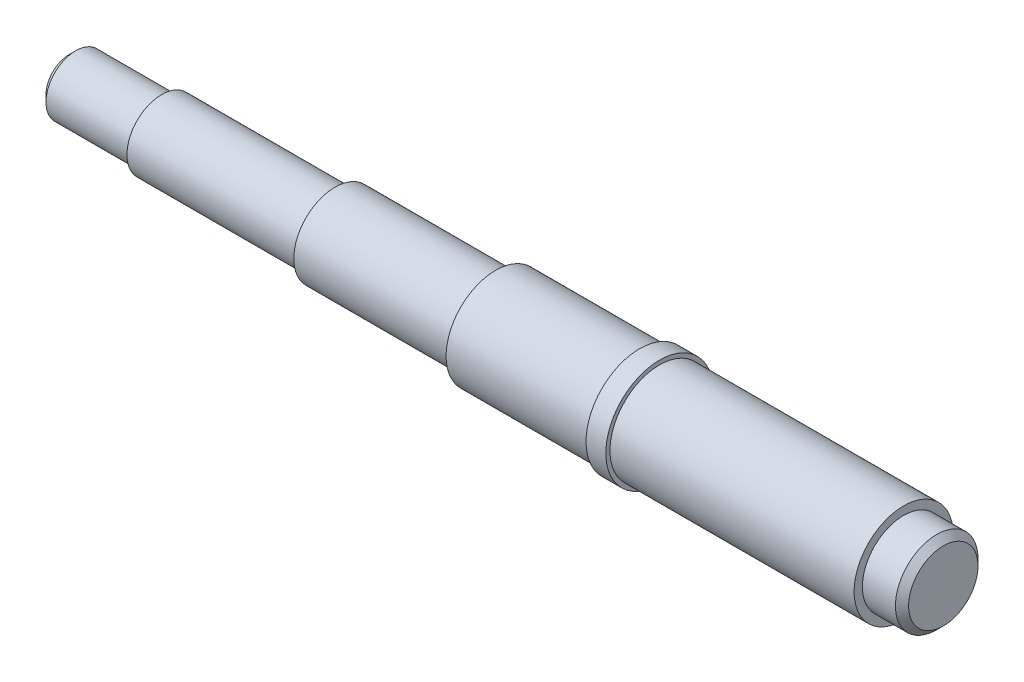
ISO-10303-21;
HEADER;
FILE_DESCRIPTION(('STEP AP214'),'2;1');
FILE_NAME('part.step','',(''),(''),'','','');
FILE_SCHEMA(('AUTOMOTIVE_DESIGN { 1 0 10303 214 1 1 1 1 }'));
ENDSEC;
DATA;
#1=APPLICATION_CONTEXT('core data for automotive mechanical design processes');
#2=APPLICATION_PROTOCOL_DEFINITION('international standard','automotive_design',2000,#1);
#3=PRODUCT_CONTEXT('',#1,'mechanical');
#4=PRODUCT('Part','Part','',(#3));
#5=PRODUCT_RELATED_PRODUCT_CATEGORY('part','',(#4));
#6=PRODUCT_DEFINITION_FORMATION('','',#4);
#7=PRODUCT_DEFINITION_CONTEXT('part definition',#1,'design');
#8=PRODUCT_DEFINITION('design','',#6,#7);
#9=PRODUCT_DEFINITION_SHAPE('','',#8);
#10=(LENGTH_UNIT() NAMED_UNIT(*) SI_UNIT(.MILLI.,.METRE.));
#11=(NAMED_UNIT(*) PLANE_ANGLE_UNIT() SI_UNIT($,.RADIAN.));
#12=(NAMED_UNIT(*) SI_UNIT($,.STERADIAN.) SOLID_ANGLE_UNIT());
#13=UNCERTAINTY_MEASURE_WITH_UNIT(LENGTH_MEASURE(1.E-05),#10,'distance_accuracy_value','');
#14=(GEOMETRIC_REPRESENTATION_CONTEXT(3) GLOBAL_UNCERTAINTY_ASSIGNED_CONTEXT((#13)) GLOBAL_UNIT_ASSIGNED_CONTEXT((#10,
#11,#12)) REPRESENTATION_CONTEXT('',''));
#15=CARTESIAN_POINT('',(0.,0.,0.));
#16=DIRECTION('',(0.,0.,1.));
#17=DIRECTION('',(1.,0.,0.));
#18=AXIS2_PLACEMENT_3D('',#15,#16,#17);
#19=CARTESIAN_POINT('',(264.6,0.,0.));
#20=DIRECTION('',(1.,0.,0.));
#21=DIRECTION('',(0.,0.,-1.));
#22=AXIS2_PLACEMENT_3D('',#19,#20,#21);
#23=CYLINDRICAL_SURFACE('',#22,15.);
#24=CARTESIAN_POINT('',(129.1,0.,0.));
#25=DIRECTION('',(1.,0.,0.));
#26=DIRECTION('',(0.,0.,-1.));
#27=AXIS2_PLACEMENT_3D('',#24,#25,#26);
#28=CIRCLE('',#27,15.);
#29=CARTESIAN_POINT('',(129.1,0.,-15.));
#30=VERTEX_POINT('',#29);
#31=EDGE_CURVE('E119',#30,#30,#28,.T.);
#32=ORIENTED_EDGE('',*,*,#31,.T.);
#33=EDGE_LOOP('',(#32));
#34=FACE_BOUND('',#33,.T.);
#35=CARTESIAN_POINT('',(172.7,0.,0.));
#36=DIRECTION('',(1.,0.,0.));
#37=DIRECTION('',(0.,0.,-1.));
#38=AXIS2_PLACEMENT_3D('',#35,#36,#37);
#39=CIRCLE('',#38,15.);
#40=CARTESIAN_POINT('',(172.7,0.,-15.));
#41=VERTEX_POINT('',#40);
#42=EDGE_CURVE('E116',#41,#41,#39,.T.);
#43=ORIENTED_EDGE('',*,*,#42,.F.);
#44=EDGE_LOOP('',(#43));
#45=FACE_BOUND('',#44,.T.);
#46=DIRECTION('',(1.,0.,0.));
#47=VECTOR('',#46,1.);
#48=CARTESIAN_POINT('',(264.6,-4.,-14.4568322948009));
#49=LINE('',#48,#47);
#50=CARTESIAN_POINT('',(163.4,-4.,-14.4568322948009));
#51=VERTEX_POINT('',#50);
#52=CARTESIAN_POINT('',(138.4,-4.,-14.4568322948009));
#53=VERTEX_POINT('',#52);
#54=EDGE_CURVE('E43',#51,#53,#49,.F.);
#55=ORIENTED_EDGE('',*,*,#54,.F.);
#56=CARTESIAN_POINT('',(163.4,0.,0.));
#57=DIRECTION('',(-1.,0.,0.));
#58=DIRECTION('',(0.,0.,1.));
#59=AXIS2_PLACEMENT_3D('',#56,#57,#58);
#60=CIRCLE('',#59,15.);
#61=CARTESIAN_POINT('',(163.4,4.,-14.4568322948009));
#62=VERTEX_POINT('',#61);
#63=EDGE_CURVE('E11',#51,#62,#60,.F.);
#64=ORIENTED_EDGE('',*,*,#63,.T.);
#65=DIRECTION('',(1.,0.,0.));
#66=VECTOR('',#65,1.);
#67=CARTESIAN_POINT('',(264.6,4.,-14.4568322948009));
#68=LINE('',#67,#66);
#69=CARTESIAN_POINT('',(138.4,4.,-14.4568322948009));
#70=VERTEX_POINT('',#69);
#71=EDGE_CURVE('E78',#62,#70,#68,.F.);
#72=ORIENTED_EDGE('',*,*,#71,.T.);
#73=CARTESIAN_POINT('',(138.4,0.,0.));
#74=DIRECTION('',(-1.,0.,0.));
#75=DIRECTION('',(0.,0.,1.));
#76=AXIS2_PLACEMENT_3D('',#73,#74,#75);
#77=CIRCLE('',#76,15.);
#78=EDGE_CURVE('E150',#53,#70,#77,.F.);
#79=ORIENTED_EDGE('',*,*,#78,.F.);
#80=EDGE_LOOP('',(#55,#64,#72,#79));
#81=FACE_BOUND('',#80,.T.);
#82=ADVANCED_FACE('F34',(#34,#45,#81),#23,.T.);
#83=CARTESIAN_POINT('',(0.,0.,0.));
#84=DIRECTION('',(-1.,0.,0.));
#85=DIRECTION('',(0.,0.,1.));
#86=AXIS2_PLACEMENT_3D('',#83,#84,#85);
#87=PLANE('',#86);
#88=CARTESIAN_POINT('',(0.,0.,0.));
#89=DIRECTION('',(-1.,0.,0.));
#90=DIRECTION('',(0.,0.,1.));
#91=AXIS2_PLACEMENT_3D('',#88,#89,#90);
#92=CIRCLE('',#91,7.00000000000006);
#93=CARTESIAN_POINT('',(0.,0.,7.00000000000006));
#94=VERTEX_POINT('',#93);
#95=EDGE_CURVE('E146',#94,#94,#92,.T.);
#96=ORIENTED_EDGE('',*,*,#95,.T.);
#97=EDGE_LOOP('',(#96));
#98=FACE_BOUND('',#97,.T.);
#99=ADVANCED_FACE('F160',(#98),#87,.T.);
#100=CARTESIAN_POINT('',(264.6,0.,0.));
#101=DIRECTION('',(1.,0.,0.));
#102=DIRECTION('',(0.,0.,-1.));
#103=AXIS2_PLACEMENT_3D('',#100,#101,#102);
#104=CYLINDRICAL_SURFACE('',#103,9.);
#105=CARTESIAN_POINT('',(1.99999999999989,0.,0.));
#106=DIRECTION('',(-1.,0.,0.));
#107=DIRECTION('',(0.,0.,1.));
#108=AXIS2_PLACEMENT_3D('',#105,#106,#107);
#109=CIRCLE('',#108,9.);
#110=CARTESIAN_POINT('',(1.99999999999989,0.,9.));
#111=VERTEX_POINT('',#110);
#112=EDGE_CURVE('E143',#111,#111,#109,.F.);
#113=ORIENTED_EDGE('',*,*,#112,.T.);
#114=EDGE_LOOP('',(#113));
#115=FACE_BOUND('',#114,.T.);
#116=CARTESIAN_POINT('',(28.,0.,0.));
#117=DIRECTION('',(1.,0.,0.));
#118=DIRECTION('',(0.,0.,-1.));
#119=AXIS2_PLACEMENT_3D('',#116,#117,#118);
#120=CIRCLE('',#119,9.);
#121=CARTESIAN_POINT('',(28.,0.,-9.));
#122=VERTEX_POINT('',#121);
#123=EDGE_CURVE('E134',#122,#122,#120,.T.);
#124=ORIENTED_EDGE('',*,*,#123,.F.);
#125=EDGE_LOOP('',(#124));
#126=FACE_BOUND('',#125,.T.);
#127=ADVANCED_FACE('F166',(#115,#126),#104,.T.);
#128=CARTESIAN_POINT('',(28.,9.,0.));
#129=DIRECTION('',(-1.,0.,0.));
#130=DIRECTION('',(0.,0.,1.));
#131=AXIS2_PLACEMENT_3D('',#128,#129,#130);
#132=PLANE('',#131);
#133=ORIENTED_EDGE('',*,*,#123,.T.);
#134=EDGE_LOOP('',(#133));
#135=FACE_BOUND('',#134,.T.);
#136=CARTESIAN_POINT('',(28.,0.,0.));
#137=DIRECTION('',(1.,0.,0.));
#138=DIRECTION('',(0.,0.,-1.));
#139=AXIS2_PLACEMENT_3D('',#136,#137,#138);
#140=CIRCLE('',#139,10.5);
#141=CARTESIAN_POINT('',(28.,0.,-10.5));
#142=VERTEX_POINT('',#141);
#143=EDGE_CURVE('E131',#142,#142,#140,.T.);
#144=ORIENTED_EDGE('',*,*,#143,.F.);
#145=EDGE_LOOP('',(#144));
#146=FACE_BOUND('',#145,.T.);
#147=ADVANCED_FACE('F189',(#135,#146),#132,.T.);
#148=CARTESIAN_POINT('',(264.6,0.,0.));
#149=DIRECTION('',(1.,0.,0.));
#150=DIRECTION('',(0.,0.,-1.));
#151=AXIS2_PLACEMENT_3D('',#148,#149,#150);
#152=CYLINDRICAL_SURFACE('',#151,10.5);
#153=ORIENTED_EDGE('',*,*,#143,.T.);
#154=EDGE_LOOP('',(#153));
#155=FACE_BOUND('',#154,.T.);
#156=CARTESIAN_POINT('',(80.5,0.,0.));
#157=DIRECTION('',(1.,0.,0.));
#158=DIRECTION('',(0.,0.,-1.));
#159=AXIS2_PLACEMENT_3D('',#156,#157,#158);
#160=CIRCLE('',#159,10.5);
#161=CARTESIAN_POINT('',(80.5,0.,-10.5));
#162=VERTEX_POINT('',#161);
#163=EDGE_CURVE('E128',#162,#162,#160,.T.);
#164=ORIENTED_EDGE('',*,*,#163,.F.);
#165=EDGE_LOOP('',(#164));
#166=FACE_BOUND('',#165,.T.);
#167=ADVANCED_FACE('F185',(#155,#166),#152,.T.);
#168=CARTESIAN_POINT('',(80.5,10.5,0.));
#169=DIRECTION('',(-1.,0.,0.));
#170=DIRECTION('',(0.,0.,1.));
#171=AXIS2_PLACEMENT_3D('',#168,#169,#170);
#172=PLANE('',#171);
#173=ORIENTED_EDGE('',*,*,#163,.T.);
#174=EDGE_LOOP('',(#173));
#175=FACE_BOUND('',#174,.T.);
#176=CARTESIAN_POINT('',(80.5,0.,0.));
#177=DIRECTION('',(1.,0.,0.));
#178=DIRECTION('',(0.,0.,-1.));
#179=AXIS2_PLACEMENT_3D('',#176,#177,#178);
#180=CIRCLE('',#179,12.5);
#181=CARTESIAN_POINT('',(80.5,0.,-12.5));
#182=VERTEX_POINT('',#181);
#183=EDGE_CURVE('E125',#182,#182,#180,.T.);
#184=ORIENTED_EDGE('',*,*,#183,.F.);
#185=EDGE_LOOP('',(#184));
#186=FACE_BOUND('',#185,.T.);
#187=ADVANCED_FACE('F181',(#175,#186),#172,.T.);
#188=CARTESIAN_POINT('',(264.6,0.,0.));
#189=DIRECTION('',(1.,0.,0.));
#190=DIRECTION('',(0.,0.,-1.));
#191=AXIS2_PLACEMENT_3D('',#188,#189,#190);
#192=CYLINDRICAL_SURFACE('',#191,12.5);
#193=ORIENTED_EDGE('',*,*,#183,.T.);
#194=EDGE_LOOP('',(#193));
#195=FACE_BOUND('',#194,.T.);
#196=CARTESIAN_POINT('',(129.1,0.,0.));
#197=DIRECTION('',(1.,0.,0.));
#198=DIRECTION('',(0.,0.,-1.));
#199=AXIS2_PLACEMENT_3D('',#196,#197,#198);
#200=CIRCLE('',#199,12.5);
#201=CARTESIAN_POINT('',(129.1,0.,-12.5));
#202=VERTEX_POINT('',#201);
#203=EDGE_CURVE('E122',#202,#202,#200,.T.);
#204=ORIENTED_EDGE('',*,*,#203,.F.);
#205=EDGE_LOOP('',(#204));
#206=FACE_BOUND('',#205,.T.);
#207=ADVANCED_FACE('F177',(#195,#206),#192,.T.);
#208=CARTESIAN_POINT('',(129.1,12.5,0.));
#209=DIRECTION('',(-1.,0.,0.));
#210=DIRECTION('',(0.,0.,1.));
#211=AXIS2_PLACEMENT_3D('',#208,#209,#210);
#212=PLANE('',#211);
#213=ORIENTED_EDGE('',*,*,#203,.T.);
#214=EDGE_LOOP('',(#213));
#215=FACE_BOUND('',#214,.T.);
#216=ORIENTED_EDGE('',*,*,#31,.F.);
#217=EDGE_LOOP('',(#216));
#218=FACE_BOUND('',#217,.T.);
#219=ADVANCED_FACE('F174',(#215,#218),#212,.T.);
#220=CARTESIAN_POINT('',(172.7,15.,0.));
#221=DIRECTION('',(-1.,0.,0.));
#222=DIRECTION('',(0.,0.,1.));
#223=AXIS2_PLACEMENT_3D('',#220,#221,#222);
#224=PLANE('',#223);
#225=ORIENTED_EDGE('',*,*,#42,.T.);
#226=EDGE_LOOP('',(#225));
#227=FACE_BOUND('',#226,.T.);
#228=CARTESIAN_POINT('',(172.7,0.,0.));
#229=DIRECTION('',(1.,0.,0.));
#230=DIRECTION('',(0.,0.,-1.));
#231=AXIS2_PLACEMENT_3D('',#228,#229,#230);
#232=CIRCLE('',#231,16.25);
#233=CARTESIAN_POINT('',(172.7,0.,-16.25));
#234=VERTEX_POINT('',#233);
#235=EDGE_CURVE('E113',#234,#234,#232,.T.);
#236=ORIENTED_EDGE('',*,*,#235,.F.);
#237=EDGE_LOOP('',(#236));
#238=FACE_BOUND('',#237,.T.);
#239=ADVANCED_FACE('F172',(#227,#238),#224,.T.);
#240=CARTESIAN_POINT('',(264.6,0.,0.));
#241=DIRECTION('',(1.,0.,0.));
#242=DIRECTION('',(0.,0.,-1.));
#243=AXIS2_PLACEMENT_3D('',#240,#241,#242);
#244=CYLINDRICAL_SURFACE('',#243,16.25);
#245=ORIENTED_EDGE('',*,*,#235,.T.);
#246=EDGE_LOOP('',(#245));
#247=FACE_BOUND('',#246,.T.);
#248=CARTESIAN_POINT('',(178.7,0.,0.));
#249=DIRECTION('',(1.,0.,0.));
#250=DIRECTION('',(0.,0.,-1.));
#251=AXIS2_PLACEMENT_3D('',#248,#249,#250);
#252=CIRCLE('',#251,16.25);
#253=CARTESIAN_POINT('',(178.7,0.,-16.25));
#254=VERTEX_POINT('',#253);
#255=EDGE_CURVE('E110',#254,#254,#252,.T.);
#256=ORIENTED_EDGE('',*,*,#255,.F.);
#257=EDGE_LOOP('',(#256));
#258=FACE_BOUND('',#257,.T.);
#259=ADVANCED_FACE('F233',(#247,#258),#244,.T.);
#260=CARTESIAN_POINT('',(178.7,16.25,0.));
#261=DIRECTION('',(1.,0.,0.));
#262=DIRECTION('',(0.,0.,-1.));
#263=AXIS2_PLACEMENT_3D('',#260,#261,#262);
#264=PLANE('',#263);
#265=ORIENTED_EDGE('',*,*,#255,.T.);
#266=EDGE_LOOP('',(#265));
#267=FACE_BOUND('',#266,.T.);
#268=CARTESIAN_POINT('',(178.7,0.,0.));
#269=DIRECTION('',(1.,0.,0.));
#270=DIRECTION('',(0.,0.,-1.));
#271=AXIS2_PLACEMENT_3D('',#268,#269,#270);
#272=CIRCLE('',#271,15.);
#273=CARTESIAN_POINT('',(178.7,0.,-15.));
#274=VERTEX_POINT('',#273);
#275=EDGE_CURVE('E107',#274,#274,#272,.T.);
#276=ORIENTED_EDGE('',*,*,#275,.F.);
#277=EDGE_LOOP('',(#276));
#278=FACE_BOUND('',#277,.T.);
#279=ADVANCED_FACE('F228',(#267,#278),#264,.T.);
#280=CARTESIAN_POINT('',(264.6,0.,0.));
#281=DIRECTION('',(1.,0.,0.));
#282=DIRECTION('',(0.,0.,-1.));
#283=AXIS2_PLACEMENT_3D('',#280,#281,#282);
#284=CYLINDRICAL_SURFACE('',#283,15.);
#285=ORIENTED_EDGE('',*,*,#275,.T.);
#286=EDGE_LOOP('',(#285));
#287=FACE_BOUND('',#286,.T.);
#288=CARTESIAN_POINT('',(252.6,0.,0.));
#289=DIRECTION('',(1.,0.,0.));
#290=DIRECTION('',(0.,0.,-1.));
#291=AXIS2_PLACEMENT_3D('',#288,#289,#290);
#292=CIRCLE('',#291,15.);
#293=CARTESIAN_POINT('',(252.6,0.,-15.));
#294=VERTEX_POINT('',#293);
#295=EDGE_CURVE('E104',#294,#294,#292,.T.);
#296=ORIENTED_EDGE('',*,*,#295,.F.);
#297=EDGE_LOOP('',(#296));
#298=FACE_BOUND('',#297,.T.);
#299=ADVANCED_FACE('F222',(#287,#298),#284,.T.);
#300=CARTESIAN_POINT('',(252.6,15.,0.));
#301=DIRECTION('',(1.,0.,0.));
#302=DIRECTION('',(0.,0.,-1.));
#303=AXIS2_PLACEMENT_3D('',#300,#301,#302);
#304=PLANE('',#303);
#305=ORIENTED_EDGE('',*,*,#295,.T.);
#306=EDGE_LOOP('',(#305));
#307=FACE_BOUND('',#306,.T.);
#308=CARTESIAN_POINT('',(252.6,0.,0.));
#309=DIRECTION('',(1.,0.,0.));
#310=DIRECTION('',(0.,0.,-1.));
#311=AXIS2_PLACEMENT_3D('',#308,#309,#310);
#312=CIRCLE('',#311,12.5);
#313=CARTESIAN_POINT('',(252.6,0.,-12.5));
#314=VERTEX_POINT('',#313);
#315=EDGE_CURVE('E98',#314,#314,#312,.T.);
#316=ORIENTED_EDGE('',*,*,#315,.F.);
#317=EDGE_LOOP('',(#316));
#318=FACE_BOUND('',#317,.T.);
#319=ADVANCED_FACE('F217',(#307,#318),#304,.T.);
#320=CARTESIAN_POINT('',(264.6,0.,0.));
#321=DIRECTION('',(1.,0.,0.));
#322=DIRECTION('',(0.,0.,-1.));
#323=AXIS2_PLACEMENT_3D('',#320,#321,#322);
#324=CYLINDRICAL_SURFACE('',#323,12.5);
#325=CARTESIAN_POINT('',(262.6,0.,0.));
#326=DIRECTION('',(1.,0.,0.));
#327=DIRECTION('',(0.,0.,-1.));
#328=AXIS2_PLACEMENT_3D('',#325,#326,#327);
#329=CIRCLE('',#328,12.5);
#330=CARTESIAN_POINT('',(262.6,0.,-12.5));
#331=VERTEX_POINT('',#330);
#332=EDGE_CURVE('E140',#331,#331,#329,.F.);
#333=ORIENTED_EDGE('',*,*,#332,.T.);
#334=EDGE_LOOP('',(#333));
#335=FACE_BOUND('',#334,.T.);
#336=ORIENTED_EDGE('',*,*,#315,.T.);
#337=EDGE_LOOP('',(#336));
#338=FACE_BOUND('',#337,.T.);
#339=ADVANCED_FACE('F208',(#335,#338),#324,.T.);
#340=CARTESIAN_POINT('',(264.6,12.5,0.));
#341=DIRECTION('',(1.,0.,0.));
#342=DIRECTION('',(0.,0.,-1.));
#343=AXIS2_PLACEMENT_3D('',#340,#341,#342);
#344=PLANE('',#343);
#345=CARTESIAN_POINT('',(264.6,0.,0.));
#346=DIRECTION('',(1.,0.,0.));
#347=DIRECTION('',(0.,0.,-1.));
#348=AXIS2_PLACEMENT_3D('',#345,#346,#347);
#349=CIRCLE('',#348,10.5);
#350=CARTESIAN_POINT('',(264.6,0.,-10.5));
#351=VERTEX_POINT('',#350);
#352=EDGE_CURVE('E137',#351,#351,#349,.T.);
#353=ORIENTED_EDGE('',*,*,#352,.T.);
#354=EDGE_LOOP('',(#353));
#355=FACE_BOUND('',#354,.T.);
#356=ADVANCED_FACE('F201',(#355),#344,.T.);
#357=CARTESIAN_POINT('',(264.6,0.,0.));
#358=DIRECTION('',(-1.,0.,0.));
#359=DIRECTION('',(0.,0.,1.));
#360=AXIS2_PLACEMENT_3D('',#357,#358,#359);
#361=CONICAL_SURFACE('',#360,10.5,0.785398163397431);
#362=ORIENTED_EDGE('',*,*,#332,.F.);
#363=EDGE_LOOP('',(#362));
#364=FACE_BOUND('',#363,.T.);
#365=ORIENTED_EDGE('',*,*,#352,.F.);
#366=EDGE_LOOP('',(#365));
#367=FACE_BOUND('',#366,.T.);
#368=ADVANCED_FACE('F197',(#364,#367),#361,.T.);
#369=CARTESIAN_POINT('',(1.99999999999989,0.,0.));
#370=DIRECTION('',(1.,0.,0.));
#371=DIRECTION('',(0.,0.,-1.));
#372=AXIS2_PLACEMENT_3D('',#369,#370,#371);
#373=CONICAL_SURFACE('',#372,9.,0.78539816339746);
#374=ORIENTED_EDGE('',*,*,#95,.F.);
#375=EDGE_LOOP('',(#374));
#376=FACE_BOUND('',#375,.T.);
#377=ORIENTED_EDGE('',*,*,#112,.F.);
#378=EDGE_LOOP('',(#377));
#379=FACE_BOUND('',#378,.T.);
#380=ADVANCED_FACE('F37',(#376,#379),#373,.T.);
#381=CARTESIAN_POINT('',(163.4,0.,-39.5));
#382=DIRECTION('',(-1.,0.,0.));
#383=DIRECTION('',(0.,0.,1.));
#384=AXIS2_PLACEMENT_3D('',#381,#382,#383);
#385=PLANE('',#384);
#386=DIRECTION('',(0.,0.,1.));
#387=VECTOR('',#386,1.);
#388=CARTESIAN_POINT('',(163.4,-4.,-39.5));
#389=LINE('',#388,#387);
#390=CARTESIAN_POINT('',(163.4,-4.,-11.5));
#391=VERTEX_POINT('',#390);
#392=EDGE_CURVE('E92',#51,#391,#389,.T.);
#393=ORIENTED_EDGE('',*,*,#392,.T.);
#394=DIRECTION('',(0.,-1.,0.));
#395=VECTOR('',#394,1.);
#396=CARTESIAN_POINT('',(163.4,0.,-11.5));
#397=LINE('',#396,#395);
#398=CARTESIAN_POINT('',(163.4,4.,-11.5));
#399=VERTEX_POINT('',#398);
#400=EDGE_CURVE('E86',#399,#391,#397,.T.);
#401=ORIENTED_EDGE('',*,*,#400,.F.);
#402=DIRECTION('',(0.,0.,1.));
#403=VECTOR('',#402,1.);
#404=CARTESIAN_POINT('',(163.4,4.,-39.5));
#405=LINE('',#404,#403);
#406=EDGE_CURVE('E72',#62,#399,#405,.T.);
#407=ORIENTED_EDGE('',*,*,#406,.F.);
#408=ORIENTED_EDGE('',*,*,#63,.F.);
#409=EDGE_LOOP('',(#393,#401,#407,#408));
#410=FACE_BOUND('',#409,.T.);
#411=ADVANCED_FACE('F91',(#410),#385,.T.);
#412=CARTESIAN_POINT('',(0.,-4.,-39.5));
#413=DIRECTION('',(0.,-1.,0.));
#414=DIRECTION('',(0.,0.,-1.));
#415=AXIS2_PLACEMENT_3D('',#412,#413,#414);
#416=PLANE('',#415);
#417=ORIENTED_EDGE('',*,*,#54,.T.);
#418=DIRECTION('',(0.,0.,1.));
#419=VECTOR('',#418,1.);
#420=CARTESIAN_POINT('',(138.4,-4.,-39.5));
#421=LINE('',#420,#419);
#422=CARTESIAN_POINT('',(138.4,-4.,-11.5));
#423=VERTEX_POINT('',#422);
#424=EDGE_CURVE('E99',#53,#423,#421,.T.);
#425=ORIENTED_EDGE('',*,*,#424,.T.);
#426=DIRECTION('',(1.,0.,0.));
#427=VECTOR('',#426,1.);
#428=CARTESIAN_POINT('',(0.,-4.,-11.5));
#429=LINE('',#428,#427);
#430=EDGE_CURVE('E80',#423,#391,#429,.T.);
#431=ORIENTED_EDGE('',*,*,#430,.T.);
#432=ORIENTED_EDGE('',*,*,#392,.F.);
#433=EDGE_LOOP('',(#417,#425,#431,#432));
#434=FACE_BOUND('',#433,.T.);
#435=ADVANCED_FACE('F154',(#434),#416,.F.);
#436=CARTESIAN_POINT('',(138.4,0.,-39.5));
#437=DIRECTION('',(-1.,0.,0.));
#438=DIRECTION('',(0.,0.,1.));
#439=AXIS2_PLACEMENT_3D('',#436,#437,#438);
#440=PLANE('',#439);
#441=ORIENTED_EDGE('',*,*,#78,.T.);
#442=DIRECTION('',(0.,0.,1.));
#443=VECTOR('',#442,1.);
#444=CARTESIAN_POINT('',(138.4,4.,-39.5));
#445=LINE('',#444,#443);
#446=CARTESIAN_POINT('',(138.4,4.,-11.5));
#447=VERTEX_POINT('',#446);
#448=EDGE_CURVE('E50',#70,#447,#445,.T.);
#449=ORIENTED_EDGE('',*,*,#448,.T.);
#450=DIRECTION('',(0.,-1.,0.));
#451=VECTOR('',#450,1.);
#452=CARTESIAN_POINT('',(138.4,0.,-11.5));
#453=LINE('',#452,#451);
#454=EDGE_CURVE('E89',#447,#423,#453,.T.);
#455=ORIENTED_EDGE('',*,*,#454,.T.);
#456=ORIENTED_EDGE('',*,*,#424,.F.);
#457=EDGE_LOOP('',(#441,#449,#455,#456));
#458=FACE_BOUND('',#457,.T.);
#459=ADVANCED_FACE('F158',(#458),#440,.F.);
#460=CARTESIAN_POINT('',(0.,4.,-39.5));
#461=DIRECTION('',(0.,-1.,0.));
#462=DIRECTION('',(0.,0.,-1.));
#463=AXIS2_PLACEMENT_3D('',#460,#461,#462);
#464=PLANE('',#463);
#465=ORIENTED_EDGE('',*,*,#406,.T.);
#466=DIRECTION('',(1.,0.,0.));
#467=VECTOR('',#466,1.);
#468=CARTESIAN_POINT('',(0.,4.,-11.5));
#469=LINE('',#468,#467);
#470=EDGE_CURVE('E75',#447,#399,#469,.T.);
#471=ORIENTED_EDGE('',*,*,#470,.F.);
#472=ORIENTED_EDGE('',*,*,#448,.F.);
#473=ORIENTED_EDGE('',*,*,#71,.F.);
#474=EDGE_LOOP('',(#465,#471,#472,#473));
#475=FACE_BOUND('',#474,.T.);
#476=ADVANCED_FACE('F74',(#475),#464,.T.);
#477=CARTESIAN_POINT('',(0.,0.,-11.5));
#478=DIRECTION('',(0.,0.,1.));
#479=DIRECTION('',(1.,0.,0.));
#480=AXIS2_PLACEMENT_3D('',#477,#478,#479);
#481=PLANE('',#480);
#482=ORIENTED_EDGE('',*,*,#400,.T.);
#483=ORIENTED_EDGE('',*,*,#430,.F.);
#484=ORIENTED_EDGE('',*,*,#454,.F.);
#485=ORIENTED_EDGE('',*,*,#470,.T.);
#486=EDGE_LOOP('',(#482,#483,#484,#485));
#487=FACE_BOUND('',#486,.T.);
#488=ADVANCED_FACE('F84',(#487),#481,.F.);
#489=CLOSED_SHELL('',(#82,#99,#127,#147,#167,#187,#207,#219,#239,#259,#279,#299,#319,#339,#356,
#368,#380,#411,#435,#459,#476,#488));
#490=MANIFOLD_SOLID_BREP('B2',#489);
#491=ADVANCED_BREP_SHAPE_REPRESENTATION('',(#18,#490),#14);
#492=SHAPE_DEFINITION_REPRESENTATION(#9,#491);
ENDSEC;
END-ISO-10303-21;
